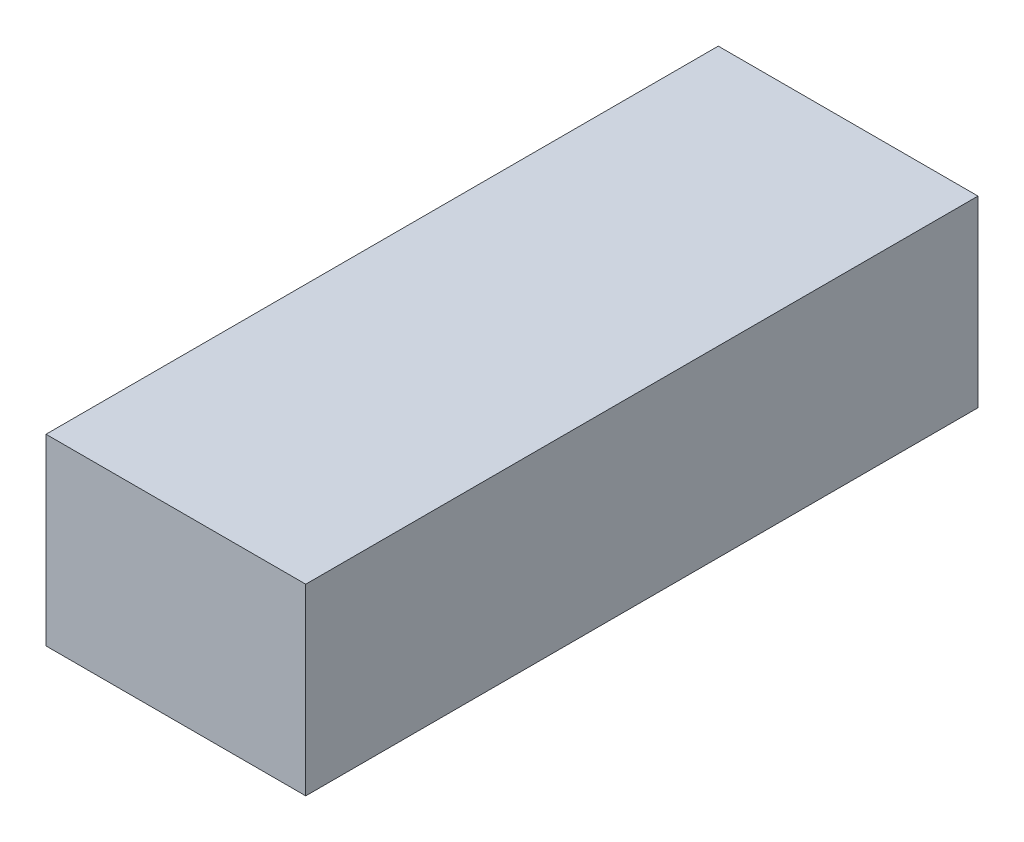
ISO-10303-21;
HEADER;
FILE_DESCRIPTION(('STEP AP214'),'2;1');
FILE_NAME('part.step','',(''),(''),'','','');
FILE_SCHEMA(('AUTOMOTIVE_DESIGN { 1 0 10303 214 1 1 1 1 }'));
ENDSEC;
DATA;
#1=APPLICATION_CONTEXT('core data for automotive mechanical design processes');
#2=APPLICATION_PROTOCOL_DEFINITION('international standard','automotive_design',2000,#1);
#3=PRODUCT_CONTEXT('',#1,'mechanical');
#4=PRODUCT('Part','Part','',(#3));
#5=PRODUCT_RELATED_PRODUCT_CATEGORY('part','',(#4));
#6=PRODUCT_DEFINITION_FORMATION('','',#4);
#7=PRODUCT_DEFINITION_CONTEXT('part definition',#1,'design');
#8=PRODUCT_DEFINITION('design','',#6,#7);
#9=PRODUCT_DEFINITION_SHAPE('','',#8);
#10=(LENGTH_UNIT() NAMED_UNIT(*) SI_UNIT(.MILLI.,.METRE.));
#11=(NAMED_UNIT(*) PLANE_ANGLE_UNIT() SI_UNIT($,.RADIAN.));
#12=(NAMED_UNIT(*) SI_UNIT($,.STERADIAN.) SOLID_ANGLE_UNIT());
#13=UNCERTAINTY_MEASURE_WITH_UNIT(LENGTH_MEASURE(1.E-05),#10,'distance_accuracy_value','');
#14=(GEOMETRIC_REPRESENTATION_CONTEXT(3) GLOBAL_UNCERTAINTY_ASSIGNED_CONTEXT((#13)) GLOBAL_UNIT_ASSIGNED_CONTEXT((#10,
#11,#12)) REPRESENTATION_CONTEXT('',''));
#15=CARTESIAN_POINT('',(0.,0.,0.));
#16=DIRECTION('',(0.,0.,1.));
#17=DIRECTION('',(1.,0.,0.));
#18=AXIS2_PLACEMENT_3D('',#15,#16,#17);
#19=CARTESIAN_POINT('',(0.,12.,0.));
#20=DIRECTION('',(1.,0.,0.));
#21=DIRECTION('',(0.,0.,-1.));
#22=AXIS2_PLACEMENT_3D('',#19,#20,#21);
#23=PLANE('',#22);
#24=DIRECTION('',(0.,0.,1.));
#25=VECTOR('',#24,1.);
#26=CARTESIAN_POINT('',(0.,0.,0.));
#27=LINE('',#26,#25);
#28=CARTESIAN_POINT('',(0.,0.,-44.));
#29=VERTEX_POINT('',#28);
#30=CARTESIAN_POINT('',(0.,0.,0.));
#31=VERTEX_POINT('',#30);
#32=EDGE_CURVE('E96',#29,#31,#27,.T.);
#33=ORIENTED_EDGE('',*,*,#32,.T.);
#34=DIRECTION('',(0.,-1.,0.));
#35=VECTOR('',#34,1.);
#36=CARTESIAN_POINT('',(0.,12.,0.));
#37=LINE('',#36,#35);
#38=CARTESIAN_POINT('',(0.,12.,0.));
#39=VERTEX_POINT('',#38);
#40=EDGE_CURVE('E11',#39,#31,#37,.T.);
#41=ORIENTED_EDGE('',*,*,#40,.F.);
#42=DIRECTION('',(0.,0.,1.));
#43=VECTOR('',#42,1.);
#44=CARTESIAN_POINT('',(0.,12.,0.));
#45=LINE('',#44,#43);
#46=CARTESIAN_POINT('',(0.,12.,-44.));
#47=VERTEX_POINT('',#46);
#48=EDGE_CURVE('E84',#47,#39,#45,.T.);
#49=ORIENTED_EDGE('',*,*,#48,.F.);
#50=DIRECTION('',(0.,-1.,0.));
#51=VECTOR('',#50,1.);
#52=CARTESIAN_POINT('',(0.,12.,-44.));
#53=LINE('',#52,#51);
#54=EDGE_CURVE('E92',#47,#29,#53,.T.);
#55=ORIENTED_EDGE('',*,*,#54,.T.);
#56=EDGE_LOOP('',(#33,#41,#49,#55));
#57=FACE_BOUND('',#56,.T.);
#58=ADVANCED_FACE('F33',(#57),#23,.F.);
#59=CARTESIAN_POINT('',(0.,12.,0.));
#60=DIRECTION('',(0.,0.,-1.));
#61=DIRECTION('',(-1.,0.,0.));
#62=AXIS2_PLACEMENT_3D('',#59,#60,#61);
#63=PLANE('',#62);
#64=DIRECTION('',(1.,0.,0.));
#65=VECTOR('',#64,1.);
#66=CARTESIAN_POINT('',(0.,0.,0.));
#67=LINE('',#66,#65);
#68=CARTESIAN_POINT('',(17.,0.,0.));
#69=VERTEX_POINT('',#68);
#70=EDGE_CURVE('E88',#31,#69,#67,.T.);
#71=ORIENTED_EDGE('',*,*,#70,.T.);
#72=DIRECTION('',(0.,-1.,0.));
#73=VECTOR('',#72,1.);
#74=CARTESIAN_POINT('',(17.,12.,0.));
#75=LINE('',#74,#73);
#76=CARTESIAN_POINT('',(17.,12.,0.));
#77=VERTEX_POINT('',#76);
#78=EDGE_CURVE('E41',#77,#69,#75,.T.);
#79=ORIENTED_EDGE('',*,*,#78,.F.);
#80=DIRECTION('',(1.,0.,0.));
#81=VECTOR('',#80,1.);
#82=CARTESIAN_POINT('',(0.,12.,0.));
#83=LINE('',#82,#81);
#84=EDGE_CURVE('E79',#39,#77,#83,.T.);
#85=ORIENTED_EDGE('',*,*,#84,.F.);
#86=ORIENTED_EDGE('',*,*,#40,.T.);
#87=EDGE_LOOP('',(#71,#79,#85,#86));
#88=FACE_BOUND('',#87,.T.);
#89=ADVANCED_FACE('F87',(#88),#63,.F.);
#90=CARTESIAN_POINT('',(17.,12.,0.));
#91=DIRECTION('',(-1.,0.,0.));
#92=DIRECTION('',(0.,0.,1.));
#93=AXIS2_PLACEMENT_3D('',#90,#91,#92);
#94=PLANE('',#93);
#95=DIRECTION('',(0.,0.,-1.));
#96=VECTOR('',#95,1.);
#97=CARTESIAN_POINT('',(17.,0.,0.));
#98=LINE('',#97,#96);
#99=CARTESIAN_POINT('',(17.,0.,-44.));
#100=VERTEX_POINT('',#99);
#101=EDGE_CURVE('E66',#69,#100,#98,.T.);
#102=ORIENTED_EDGE('',*,*,#101,.T.);
#103=DIRECTION('',(0.,-1.,0.));
#104=VECTOR('',#103,1.);
#105=CARTESIAN_POINT('',(17.,12.,-44.));
#106=LINE('',#105,#104);
#107=CARTESIAN_POINT('',(17.,12.,-44.));
#108=VERTEX_POINT('',#107);
#109=EDGE_CURVE('E89',#108,#100,#106,.T.);
#110=ORIENTED_EDGE('',*,*,#109,.F.);
#111=DIRECTION('',(0.,0.,-1.));
#112=VECTOR('',#111,1.);
#113=CARTESIAN_POINT('',(17.,12.,0.));
#114=LINE('',#113,#112);
#115=EDGE_CURVE('E82',#77,#108,#114,.T.);
#116=ORIENTED_EDGE('',*,*,#115,.F.);
#117=ORIENTED_EDGE('',*,*,#78,.T.);
#118=EDGE_LOOP('',(#102,#110,#116,#117));
#119=FACE_BOUND('',#118,.T.);
#120=ADVANCED_FACE('F90',(#119),#94,.F.);
#121=CARTESIAN_POINT('',(0.,12.,-44.));
#122=DIRECTION('',(0.,0.,1.));
#123=DIRECTION('',(1.,0.,0.));
#124=AXIS2_PLACEMENT_3D('',#121,#122,#123);
#125=PLANE('',#124);
#126=DIRECTION('',(-1.,0.,0.));
#127=VECTOR('',#126,1.);
#128=CARTESIAN_POINT('',(0.,0.,-44.));
#129=LINE('',#128,#127);
#130=EDGE_CURVE('E72',#100,#29,#129,.T.);
#131=ORIENTED_EDGE('',*,*,#130,.T.);
#132=ORIENTED_EDGE('',*,*,#54,.F.);
#133=DIRECTION('',(-1.,0.,0.));
#134=VECTOR('',#133,1.);
#135=CARTESIAN_POINT('',(0.,12.,-44.));
#136=LINE('',#135,#134);
#137=EDGE_CURVE('E49',#108,#47,#136,.T.);
#138=ORIENTED_EDGE('',*,*,#137,.F.);
#139=ORIENTED_EDGE('',*,*,#109,.T.);
#140=EDGE_LOOP('',(#131,#132,#138,#139));
#141=FACE_BOUND('',#140,.T.);
#142=ADVANCED_FACE('F103',(#141),#125,.F.);
#143=CARTESIAN_POINT('',(0.,12.,0.));
#144=DIRECTION('',(0.,-1.,0.));
#145=DIRECTION('',(0.,0.,-1.));
#146=AXIS2_PLACEMENT_3D('',#143,#144,#145);
#147=PLANE('',#146);
#148=ORIENTED_EDGE('',*,*,#48,.T.);
#149=ORIENTED_EDGE('',*,*,#84,.T.);
#150=ORIENTED_EDGE('',*,*,#115,.T.);
#151=ORIENTED_EDGE('',*,*,#137,.T.);
#152=EDGE_LOOP('',(#148,#149,#150,#151));
#153=FACE_BOUND('',#152,.T.);
#154=ADVANCED_FACE('F80',(#153),#147,.F.);
#155=CARTESIAN_POINT('',(0.,0.,0.));
#156=DIRECTION('',(0.,-1.,0.));
#157=DIRECTION('',(0.,0.,-1.));
#158=AXIS2_PLACEMENT_3D('',#155,#156,#157);
#159=PLANE('',#158);
#160=ORIENTED_EDGE('',*,*,#32,.F.);
#161=ORIENTED_EDGE('',*,*,#130,.F.);
#162=ORIENTED_EDGE('',*,*,#101,.F.);
#163=ORIENTED_EDGE('',*,*,#70,.F.);
#164=EDGE_LOOP('',(#160,#161,#162,#163));
#165=FACE_BOUND('',#164,.T.);
#166=ADVANCED_FACE('F106',(#165),#159,.T.);
#167=CLOSED_SHELL('',(#58,#89,#120,#142,#154,#166));
#168=MANIFOLD_SOLID_BREP('B2',#167);
#169=ADVANCED_BREP_SHAPE_REPRESENTATION('',(#18,#168),#14);
#170=SHAPE_DEFINITION_REPRESENTATION(#9,#169);
ENDSEC;
END-ISO-10303-21;
